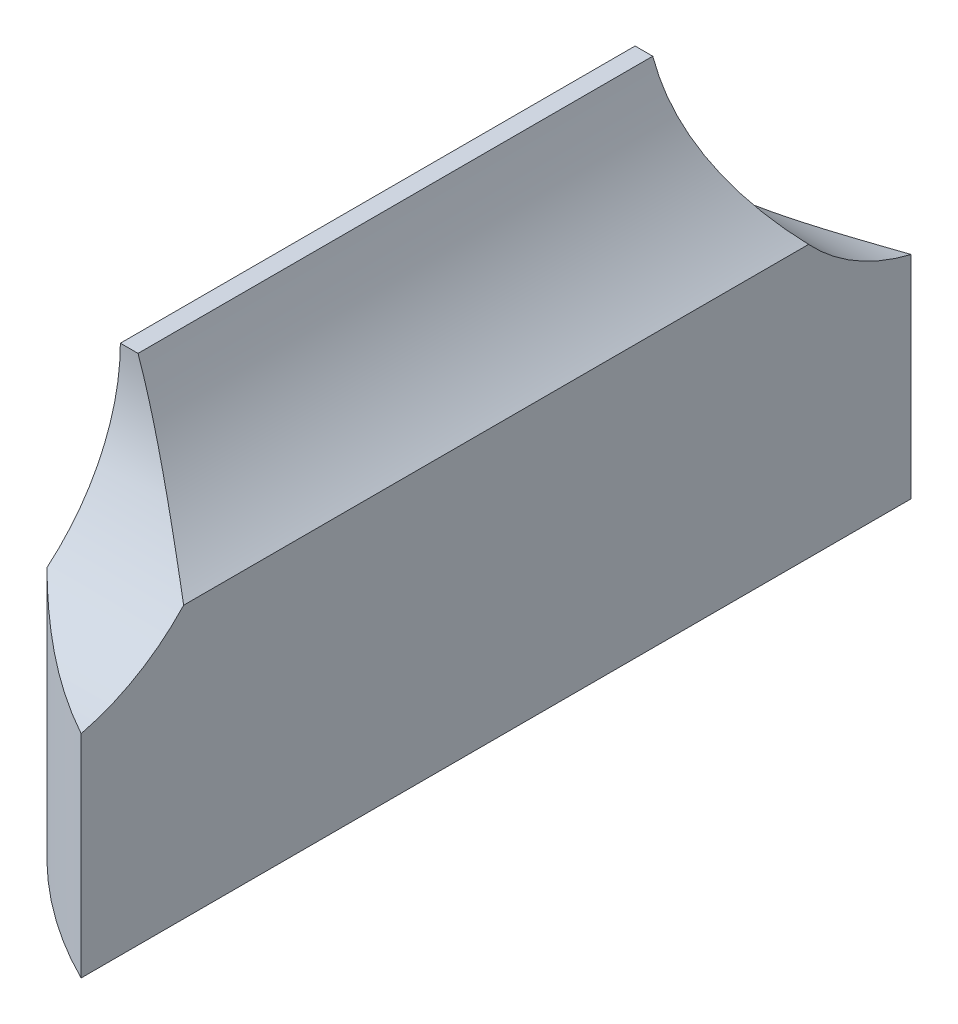
ISO-10303-21;
HEADER;
FILE_DESCRIPTION(('STEP AP214'),'2;1');
FILE_NAME('part.step','',(''),(''),'','','');
FILE_SCHEMA(('AUTOMOTIVE_DESIGN { 1 0 10303 214 1 1 1 1 }'));
ENDSEC;
DATA;
#1=APPLICATION_CONTEXT('core data for automotive mechanical design processes');
#2=APPLICATION_PROTOCOL_DEFINITION('international standard','automotive_design',2000,#1);
#3=PRODUCT_CONTEXT('',#1,'mechanical');
#4=PRODUCT('Part','Part','',(#3));
#5=PRODUCT_RELATED_PRODUCT_CATEGORY('part','',(#4));
#6=PRODUCT_DEFINITION_FORMATION('','',#4);
#7=PRODUCT_DEFINITION_CONTEXT('part definition',#1,'design');
#8=PRODUCT_DEFINITION('design','',#6,#7);
#9=PRODUCT_DEFINITION_SHAPE('','',#8);
#10=(LENGTH_UNIT() NAMED_UNIT(*) SI_UNIT(.MILLI.,.METRE.));
#11=(NAMED_UNIT(*) PLANE_ANGLE_UNIT() SI_UNIT($,.RADIAN.));
#12=(NAMED_UNIT(*) SI_UNIT($,.STERADIAN.) SOLID_ANGLE_UNIT());
#13=UNCERTAINTY_MEASURE_WITH_UNIT(LENGTH_MEASURE(1.E-05),#10,'distance_accuracy_value','');
#14=(GEOMETRIC_REPRESENTATION_CONTEXT(3) GLOBAL_UNCERTAINTY_ASSIGNED_CONTEXT((#13)) GLOBAL_UNIT_ASSIGNED_CONTEXT((#10,
#11,#12)) REPRESENTATION_CONTEXT('',''));
#15=CARTESIAN_POINT('',(0.,0.,0.));
#16=DIRECTION('',(0.,0.,1.));
#17=DIRECTION('',(1.,0.,0.));
#18=AXIS2_PLACEMENT_3D('',#15,#16,#17);
#19=CARTESIAN_POINT('',(0.,0.,0.));
#20=DIRECTION('',(0.,1.,0.));
#21=DIRECTION('',(1.,0.,0.));
#22=AXIS2_PLACEMENT_3D('',#19,#20,#21);
#23=CYLINDRICAL_SURFACE('',#22,28.575);
#24=DIRECTION('',(0.,1.,0.));
#25=VECTOR('',#24,1.);
#26=CARTESIAN_POINT('',(-12.7,0.,-25.5976683508479));
#27=LINE('',#26,#25);
#28=CARTESIAN_POINT('',(-12.7,0.,-25.5976683508479));
#29=VERTEX_POINT('',#28);
#30=CARTESIAN_POINT('',(-12.6999999902295,13.0539411382723,-25.5977402310051));
#31=VERTEX_POINT('',#30);
#32=EDGE_CURVE('E324',#29,#31,#27,.T.);
#33=ORIENTED_EDGE('',*,*,#32,.F.);
#34=CARTESIAN_POINT('',(0.,0.,0.));
#35=DIRECTION('',(0.,1.,0.));
#36=DIRECTION('',(0.,0.,1.));
#37=AXIS2_PLACEMENT_3D('',#34,#35,#36);
#38=CIRCLE('',#37,28.575);
#39=CARTESIAN_POINT('',(-20.0025,0.,-20.4066317345612));
#40=VERTEX_POINT('',#39);
#41=EDGE_CURVE('E244',#29,#40,#38,.T.);
#42=ORIENTED_EDGE('',*,*,#41,.T.);
#43=DIRECTION('',(0.,1.,0.));
#44=VECTOR('',#43,1.);
#45=CARTESIAN_POINT('',(-20.0025,0.,-20.4066317345612));
#46=LINE('',#45,#44);
#47=CARTESIAN_POINT('',(-20.002500021924,15.6757548780999,-20.4059494018305));
#48=VERTEX_POINT('',#47);
#49=EDGE_CURVE('E280',#48,#40,#46,.F.);
#50=ORIENTED_EDGE('',*,*,#49,.F.);
#51=CARTESIAN_POINT('',(-12.7000328168832,13.0538971627011,-25.5977958197599));
#52=CARTESIAN_POINT('',(-12.8081047385468,13.0668168454031,-25.5442219464865));
#53=CARTESIAN_POINT('',(-12.9157958042555,13.080258846311,-25.4900074587958));
#54=CARTESIAN_POINT('',(-13.1471686746676,13.1104431491378,-25.3717072791522));
#55=CARTESIAN_POINT('',(-13.2707151600054,13.1273727093132,-25.3074046881012));
#56=CARTESIAN_POINT('',(-13.6248694093478,13.1784078916302,-25.1197426810046));
#57=CARTESIAN_POINT('',(-13.8540399637883,13.2145208565214,-24.9941977803771));
#58=CARTESIAN_POINT('',(-14.3054896329109,13.2925640581148,-24.738641118048));
#59=CARTESIAN_POINT('',(-14.5278167405293,13.3344262310734,-24.6086933593898));
#60=CARTESIAN_POINT('',(-14.9655785716663,13.4244704629996,-24.3446393977247));
#61=CARTESIAN_POINT('',(-15.1810599635549,13.4725852034323,-24.2105877111188));
#62=CARTESIAN_POINT('',(-15.6051510146357,13.5756301209186,-23.9387052993947));
#63=CARTESIAN_POINT('',(-15.8138049489886,13.6304953596813,-23.8009192037929));
#64=CARTESIAN_POINT('',(-16.1968328640339,13.7397732066804,-23.5405056645788));
#65=CARTESIAN_POINT('',(-16.3719023817881,13.7931651792683,-23.418470215194));
#66=CARTESIAN_POINT('',(-16.7898891639244,13.9294420327401,-23.1203506597944));
#67=CARTESIAN_POINT('',(-17.0308182688671,14.015372257543,-22.9428500296811));
#68=CARTESIAN_POINT('',(-17.4726680880826,14.1881323030507,-22.6071882970164));
#69=CARTESIAN_POINT('',(-17.6746545473753,14.2733288067826,-22.4495874017132));
#70=CARTESIAN_POINT('',(-18.0687297800537,14.4531370629286,-22.1338260295291));
#71=CARTESIAN_POINT('',(-18.2609179524418,14.547599126472,-21.9757047736665));
#72=CARTESIAN_POINT('',(-18.6354100555127,14.7463016506196,-21.6595735530995));
#73=CARTESIAN_POINT('',(-18.8178089104672,14.8504017310348,-21.5015879866082));
#74=CARTESIAN_POINT('',(-19.1727235711137,15.0687301783186,-21.1864151664936));
#75=CARTESIAN_POINT('',(-19.3453280018027,15.1828302885903,-21.0292391795995));
#76=CARTESIAN_POINT('',(-19.6806651962516,15.4214396642618,-20.7164597515998));
#77=CARTESIAN_POINT('',(-19.8434780845128,15.5458360414678,-20.5608559852277));
#78=CARTESIAN_POINT('',(-20.0019983293157,15.6761376401519,-20.4057588598004));
#79=B_SPLINE_CURVE_WITH_KNOTS('',3,(#51,#52,#53,#54,#55,#56,#57,#58,#59,#60,#61,#62,#63,#64,#65,
#66,#67,#68,#69,#70,#71,#72,#73,#74,#75,#76,#77,#78),.UNSPECIFIED.,.F.,.F.,(4,2,2,2,2,2,2,2,2,2,
2,2,2,4),(0.,0.363930877339899,0.78482255493865,1.57601018208145,2.35853016431059,
3.13323222248142,3.9009920168219,4.56082120597562,5.49442520777823,6.3041096231241,
7.10237776587878,7.89044509343239,8.66957478998411,9.44107392641637),.UNSPECIFIED.);
#80=EDGE_CURVE('E264',#31,#48,#79,.T.);
#81=ORIENTED_EDGE('',*,*,#80,.F.);
#82=EDGE_LOOP('',(#33,#42,#50,#81));
#83=FACE_BOUND('',#82,.T.);
#84=ADVANCED_FACE('F49',(#83),#23,.T.);
#85=CARTESIAN_POINT('',(-0.9525,31.75,103.07574));
#86=DIRECTION('',(0.,0.,-1.));
#87=DIRECTION('',(0.,-1.,0.));
#88=AXIS2_PLACEMENT_3D('',#85,#86,#87);
#89=CYLINDRICAL_SURFACE('',#88,19.05);
#90=CARTESIAN_POINT('',(-18.9130122421383,25.4,15.875));
#91=CARTESIAN_POINT('',(-18.8497340693018,25.2210118693997,15.8749983411045));
#92=CARTESIAN_POINT('',(-18.7837855333039,25.0430075911527,15.8787844217914));
#93=CARTESIAN_POINT('',(-18.6467231259065,24.6893406660285,15.8936640856254));
#94=CARTESIAN_POINT('',(-18.5756101250626,24.5136776303775,15.9047564397118));
#95=CARTESIAN_POINT('',(-18.3550106585534,23.991278727185,15.9485421390167));
#96=CARTESIAN_POINT('',(-18.1980420811135,23.6485070556184,15.9917460206988));
#97=CARTESIAN_POINT('',(-17.8676527463349,22.9797135216138,16.1031892911451));
#98=CARTESIAN_POINT('',(-17.6944137433812,22.6535576652485,16.1711719752605));
#99=CARTESIAN_POINT('',(-17.3318691136895,22.01586555251,16.3297706721651));
#100=CARTESIAN_POINT('',(-17.1425559450336,21.7043362664966,16.4203973485763));
#101=CARTESIAN_POINT('',(-16.7049293713447,21.0280349659102,16.6447801029816));
#102=CARTESIAN_POINT('',(-16.4529997706711,20.6673005932043,16.7836581871037));
#103=CARTESIAN_POINT('',(-15.9308011524718,19.9711007243284,17.0875550697262));
#104=CARTESIAN_POINT('',(-15.6605297441538,19.6356385343733,17.2525772797803));
#105=CARTESIAN_POINT('',(-15.1032750036858,18.989084751423,17.6056610309178));
#106=CARTESIAN_POINT('',(-14.8162274474123,18.6780991821814,17.7938146310689));
#107=CARTESIAN_POINT('',(-14.2288791960802,18.0819567006576,18.189230718099));
#108=CARTESIAN_POINT('',(-13.9285774483285,17.7968018454491,18.3964947242207));
#109=CARTESIAN_POINT('',(-13.1984156246132,17.1464796343369,18.9105581416618));
#110=CARTESIAN_POINT('',(-12.7633697885075,16.7930239111386,19.2248493942131));
#111=CARTESIAN_POINT('',(-11.8763082571562,16.1333859449065,19.8781349126605));
#112=CARTESIAN_POINT('',(-11.4242863569987,15.8272212003951,20.2171382545109));
#113=CARTESIAN_POINT('',(-10.5065380825637,15.2601831655952,20.9149476019626));
#114=CARTESIAN_POINT('',(-10.0407984921444,14.9993553427282,21.2737730169768));
#115=CARTESIAN_POINT('',(-9.09905108543925,14.5216811645559,22.0066302810007));
#116=CARTESIAN_POINT('',(-8.62304394915615,14.304831906457,22.3806611244225));
#117=CARTESIAN_POINT('',(-7.55969097350217,13.8713976005961,23.222326626343));
#118=CARTESIAN_POINT('',(-6.97044213906647,13.6649246374295,23.6927739133145));
#119=CARTESIAN_POINT('',(-5.78364541772904,13.312379689528,24.6459168261099));
#120=CARTESIAN_POINT('',(-5.18609478958904,13.1663281705537,25.1286165433765));
#121=CARTESIAN_POINT('',(-3.98717431390972,12.9333741588415,26.1006321479538));
#122=CARTESIAN_POINT('',(-3.38581552424748,12.8463443988912,26.5899314644817));
#123=CARTESIAN_POINT('',(-2.18085829712548,12.7300198955487,27.5720588304996));
#124=CARTESIAN_POINT('',(-1.57726149500966,12.7006890890866,28.064884482488));
#125=CARTESIAN_POINT('',(-0.966754793001582,12.7000040018608,28.5633610103794));
#126=CARTESIAN_POINT('',(-0.95962738006711,12.7000000019469,28.5691805186742));
#127=CARTESIAN_POINT('',(-0.9525,12.7,28.575));
#128=B_SPLINE_CURVE_WITH_KNOTS('',3,(#90,#91,#92,#93,#94,#95,#96,#97,#98,#99,#100,#101,#102,
#103,#104,#105,#106,#107,#108,#109,#110,#111,#112,#113,#114,#115,#116,#117,#118,#119,#120,#121,
#122,#123,#124,#125,#126,#127),.UNSPECIFIED.,.F.,.F.,(4,2,2,2,2,2,2,2,2,2,2,2,2,2,2,2,2,2,4),
(0.,0.569405310393191,1.13871485992012,2.27535004648464,3.40052983933086,4.52624050947126,
5.9083905584972,7.29072111341501,8.6787429283433,10.0668751837947,11.9919097522487,
13.917654920933,15.8453203726628,17.7728585478994,20.115464646911,22.4588635776714,
24.7971932887953,27.1340610293043,27.1616653793962),.UNSPECIFIED.);
#129=CARTESIAN_POINT('',(-18.9130122421383,25.4,15.875));
#130=VERTEX_POINT('',#129);
#131=CARTESIAN_POINT('',(-12.7,16.7533755881532,19.2730708301743));
#132=VERTEX_POINT('',#131);
#133=EDGE_CURVE('E130',#130,#132,#128,.T.);
#134=ORIENTED_EDGE('',*,*,#133,.T.);
#135=DIRECTION('',(0.,0.,-1.));
#136=VECTOR('',#135,1.);
#137=CARTESIAN_POINT('',(-12.7,16.7533755881532,103.07574));
#138=LINE('',#137,#136);
#139=CARTESIAN_POINT('',(-12.6999998687876,16.7536945326387,-19.2730582369655));
#140=VERTEX_POINT('',#139);
#141=EDGE_CURVE('E68',#132,#140,#138,.T.);
#142=ORIENTED_EDGE('',*,*,#141,.T.);
#143=CARTESIAN_POINT('',(-18.9130122421383,25.4,-15.875));
#144=CARTESIAN_POINT('',(-18.8626214367329,25.2648276233783,-15.8749945149163));
#145=CARTESIAN_POINT('',(-18.8117207478638,25.1298398647751,-15.8771580605399));
#146=CARTESIAN_POINT('',(-18.7129604021271,24.8725351575405,-15.8853658286525));
#147=CARTESIAN_POINT('',(-18.6652314650349,24.7501563281996,-15.8910488212055));
#148=CARTESIAN_POINT('',(-18.5728177693084,24.5181293049488,-15.9051745343732));
#149=CARTESIAN_POINT('',(-18.5282879917753,24.4083998022345,-15.9132953546811));
#150=CARTESIAN_POINT('',(-18.4423104863336,24.2016597974375,-15.9312842291498));
#151=CARTESIAN_POINT('',(-18.4010456447489,24.1045494103142,-15.9408708196685));
#152=CARTESIAN_POINT('',(-18.3327294150212,23.9491355686568,-15.9580069575726));
#153=CARTESIAN_POINT('',(-18.3063984610142,23.8904418019152,-15.9648966775626));
#154=CARTESIAN_POINT('',(-18.2147951170109,23.6895929204792,-15.9898860573859));
#155=CARTESIAN_POINT('',(-18.147825682967,23.5484475628139,-16.0098932502915));
#156=CARTESIAN_POINT('',(-17.9744463608505,23.1935612014671,-16.066247998897));
#157=CARTESIAN_POINT('',(-17.8660547912868,22.9812606298124,-16.105618832032));
#158=CARTESIAN_POINT('',(-17.6771632093597,22.6277512555392,-16.1803897530837));
#159=CARTESIAN_POINT('',(-17.5984973922152,22.4850049896949,-16.2132039271015));
#160=CARTESIAN_POINT('',(-17.4825815087581,22.2808095992132,-16.2638323851313));
#161=CARTESIAN_POINT('',(-17.4465739703863,22.2182053263794,-16.2798653143452));
#162=CARTESIAN_POINT('',(-17.2955115616295,21.9590053311519,-16.3483477551744));
#163=CARTESIAN_POINT('',(-17.177680624085,21.7650199910601,-16.4046669879607));
#164=CARTESIAN_POINT('',(-16.9338127754479,21.3791103797921,-16.5265865833717));
#165=CARTESIAN_POINT('',(-16.8076546568963,21.187317627151,-16.5923588214102));
#166=CARTESIAN_POINT('',(-16.5471166055158,20.8062437320132,-16.7331441784388));
#167=CARTESIAN_POINT('',(-16.4126179391228,20.6171063336692,-16.8083262200132));
#168=CARTESIAN_POINT('',(-16.1353885755606,20.2418033226618,-16.9678691653342));
#169=CARTESIAN_POINT('',(-15.9925421934348,20.0557930746363,-17.0523948031776));
#170=CARTESIAN_POINT('',(-15.7943431002165,19.8072428283444,-17.1725227174458));
#171=CARTESIAN_POINT('',(-15.7411536160871,19.7414502737772,-17.2050322987756));
#172=CARTESIAN_POINT('',(-15.6055983002389,19.5760568345813,-17.2885364576574));
#173=CARTESIAN_POINT('',(-15.5227917173962,19.4771266482311,-17.3401481030605));
#174=CARTESIAN_POINT('',(-15.3062887529157,19.2237567177762,-17.4765651864114));
#175=CARTESIAN_POINT('',(-15.1714751676829,19.0711121872497,-17.5629399376589));
#176=CARTESIAN_POINT('',(-14.8949656353853,18.7678631561025,-17.7427962808453));
#177=CARTESIAN_POINT('',(-14.753181868802,18.6174138233302,-17.8364039818606));
#178=CARTESIAN_POINT('',(-14.4627226882301,18.3189308751102,-18.0307606346486));
#179=CARTESIAN_POINT('',(-14.3139637684477,18.1710577271823,-18.1316310618897));
#180=CARTESIAN_POINT('',(-14.0095508199111,17.8781158359111,-18.3405271853636));
#181=CARTESIAN_POINT('',(-13.8538175585003,17.7332126065009,-18.4486693258685));
#182=CARTESIAN_POINT('',(-13.5354531344088,17.4466084096042,-18.6721013121384));
#183=CARTESIAN_POINT('',(-13.3727468257159,17.3050776875598,-18.7875021989448));
#184=CARTESIAN_POINT('',(-13.0404256499506,17.0256239682438,-19.0254289680463));
#185=CARTESIAN_POINT('',(-12.8707393229377,16.8878756315075,-19.1480603249865));
#186=CARTESIAN_POINT('',(-12.6996862699256,16.7537679191644,-19.2727061536237));
#187=B_SPLINE_CURVE_WITH_KNOTS('',3,(#143,#144,#145,#146,#147,#148,#149,#150,#151,#152,#153,
#154,#155,#156,#157,#158,#159,#160,#161,#162,#163,#164,#165,#166,#167,#168,#169,#170,#171,#172,
#173,#174,#175,#176,#177,#178,#179,#180,#181,#182,#183,#184,#185,#186),.UNSPECIFIED.,.F.,.F.,(4,
2,2,2,2,2,2,2,2,2,2,2,2,2,2,2,2,2,2,2,2,4),(0.,0.432768495421759,0.827151258287931,
1.18320381967725,1.50100216150825,1.69508410052054,2.16747508219468,2.89186908900796,
3.39052415737425,3.61245574245645,4.31367076502273,5.02979506371342,5.7613883467752,
6.50897557895269,6.78087197211069,7.19768612763921,7.86115549330944,8.54180441937825,
9.23987975264813,9.95561030894167,10.6892083830743,11.4408711301362),.UNSPECIFIED.);
#188=CARTESIAN_POINT('',(-18.9130122421383,25.4,-15.875));
#189=VERTEX_POINT('',#188);
#190=EDGE_CURVE('E261',#189,#140,#187,.T.);
#191=ORIENTED_EDGE('',*,*,#190,.F.);
#192=DIRECTION('',(0.,0.,-1.));
#193=VECTOR('',#192,1.);
#194=CARTESIAN_POINT('',(-18.9130122421383,25.4,103.07574));
#195=LINE('',#194,#193);
#196=EDGE_CURVE('E270',#130,#189,#195,.T.);
#197=ORIENTED_EDGE('',*,*,#196,.F.);
#198=EDGE_LOOP('',(#134,#142,#191,#197));
#199=FACE_BOUND('',#198,.T.);
#200=ADVANCED_FACE('F156',(#199),#89,.F.);
#201=DIRECTION('',(0.,1.,0.));
#202=VECTOR('',#201,1.);
#203=CARTESIAN_POINT('',(-12.7,0.,25.5976683508479));
#204=LINE('',#203,#202);
#205=CARTESIAN_POINT('',(-12.7,13.0539279019213,25.5976683508479));
#206=VERTEX_POINT('',#205);
#207=CARTESIAN_POINT('',(-12.7,0.,25.5976683508479));
#208=VERTEX_POINT('',#207);
#209=EDGE_CURVE('E111',#206,#208,#204,.F.);
#210=ORIENTED_EDGE('',*,*,#209,.F.);
#211=CARTESIAN_POINT('',(-0.962642902409268,12.7000103571768,28.558780499917));
#212=CARTESIAN_POINT('',(-1.360776150308,12.7000623405133,28.5453656938384));
#213=CARTESIAN_POINT('',(-1.75862825688904,12.7000777129765,28.5236151588993));
#214=CARTESIAN_POINT('',(-2.55307899623697,12.7004445435241,28.4635033904881));
#215=CARTESIAN_POINT('',(-2.94967761792567,12.7007960045706,28.4251420106221));
#216=CARTESIAN_POINT('',(-3.74118366921356,12.7022448100237,28.3318388404825));
#217=CARTESIAN_POINT('',(-4.13608981320238,12.7033426454376,28.2768861487448));
#218=CARTESIAN_POINT('',(-4.92324947447722,12.7069381444453,28.1505085427591));
#219=CARTESIAN_POINT('',(-5.31550300582046,12.7094358006151,28.0790837158739));
#220=CARTESIAN_POINT('',(-6.09971504116634,12.7166858056301,27.9192672118528));
#221=CARTESIAN_POINT('',(-6.49164726347302,12.7214556290704,27.8307472529654));
#222=CARTESIAN_POINT('',(-7.27137941730528,12.7342954372854,27.6372759368344));
#223=CARTESIAN_POINT('',(-7.65917937418507,12.7423654017996,27.5323246804699));
#224=CARTESIAN_POINT('',(-8.42975640725776,12.7630247664454,27.3062442784221));
#225=CARTESIAN_POINT('',(-8.81253540320888,12.7756123837613,27.1851215263726));
#226=CARTESIAN_POINT('',(-9.57240196747794,12.8067151018844,26.9269527073139));
#227=CARTESIAN_POINT('',(-9.94948990979465,12.8252298113893,26.7899076918614));
#228=CARTESIAN_POINT('',(-10.872892757589,12.8802289714999,26.4321390526004));
#229=CARTESIAN_POINT('',(-11.4154826552638,12.9210691871269,26.2023507001296));
#230=CARTESIAN_POINT('',(-12.4837500266746,13.0247001334087,25.7105492113084));
#231=CARTESIAN_POINT('',(-13.0094275044063,13.0874908588777,25.4485360825714));
#232=CARTESIAN_POINT('',(-14.0386470858098,13.2413188734453,24.8955218171353));
#233=CARTESIAN_POINT('',(-14.5422624205979,13.3322531031986,24.604629033279));
#234=CARTESIAN_POINT('',(-15.525303301913,13.5496409172654,23.9964408297592));
#235=CARTESIAN_POINT('',(-16.0047377469761,13.6760813211802,23.6791552381835));
#236=CARTESIAN_POINT('',(-16.8002547898696,13.9292795839768,23.1180863962723));
#237=CARTESIAN_POINT('',(-17.12347917105,14.0453697562296,22.879584210023));
#238=CARTESIAN_POINT('',(-17.7534814131743,14.3020869365986,22.3942506229862));
#239=CARTESIAN_POINT('',(-18.0602635161122,14.4427075758017,22.1474213975555));
#240=CARTESIAN_POINT('',(-18.6552298763255,14.7509891906524,21.6486405827841));
#241=CARTESIAN_POINT('',(-18.9434257661047,14.9186330188443,21.3966923297255));
#242=CARTESIAN_POINT('',(-19.4993082019246,15.283253526771,20.891352140316));
#243=CARTESIAN_POINT('',(-19.7669984548302,15.4802248858392,20.6379604738353));
#244=CARTESIAN_POINT('',(-20.2341271799023,15.8672649269097,20.1791498359515));
#245=CARTESIAN_POINT('',(-20.4372307457045,16.0523162460652,19.9732236603815));
#246=CARTESIAN_POINT('',(-20.8271119032822,16.4437967712389,19.5663328087751));
#247=CARTESIAN_POINT('',(-21.0138928922229,16.6502215092427,19.3653671066091));
#248=CARTESIAN_POINT('',(-21.3701713388689,17.0844581862876,18.97147678078));
#249=CARTESIAN_POINT('',(-21.5396731298456,17.3122647355442,18.7785501482928));
#250=CARTESIAN_POINT('',(-21.8606787693188,17.7888329761912,18.4038644456923));
#251=CARTESIAN_POINT('',(-22.0121823832137,18.0375949406577,18.2221055211622));
#252=CARTESIAN_POINT('',(-22.2974382725317,18.5565357054137,17.8719385766044));
#253=CARTESIAN_POINT('',(-22.4310835814289,18.8268293204683,17.7036132443668));
#254=CARTESIAN_POINT('',(-22.6792372793649,19.3860036069173,17.3845820904193));
#255=CARTESIAN_POINT('',(-22.7937450745915,19.6748848546768,17.2338768154804));
#256=CARTESIAN_POINT('',(-23.0034597025055,20.2691361978424,16.9529413254661));
#257=CARTESIAN_POINT('',(-23.0986674148251,20.5745055409733,16.82271017731));
#258=CARTESIAN_POINT('',(-23.2697906025732,21.1992400080776,16.5852020755226));
#259=CARTESIAN_POINT('',(-23.3457083796057,21.5186034569894,16.4779223836495));
#260=CARTESIAN_POINT('',(-23.4701116509625,22.12802888617,16.3001450750939));
#261=CARTESIAN_POINT('',(-23.5208356823847,22.4167889072292,16.2267309964582));
#262=CARTESIAN_POINT('',(-23.6076984467591,23.0008228742548,16.1000964209121));
#263=CARTESIAN_POINT('',(-23.6438389597464,23.2960960205993,16.0468734595617));
#264=CARTESIAN_POINT('',(-23.7016972572095,23.891676000038,15.9612926924243));
#265=CARTESIAN_POINT('',(-23.7233869802868,24.1919914725829,15.9289754861824));
#266=CARTESIAN_POINT('',(-23.7450719580124,24.6440955561162,15.8966136680399));
#267=CARTESIAN_POINT('',(-23.750492013807,24.7951042402365,15.8885120518578));
#268=CARTESIAN_POINT('',(-23.7577175691629,25.0974022821663,15.8777046290994));
#269=CARTESIAN_POINT('',(-23.7595230358051,25.2486916425195,15.8749988716645));
#270=CARTESIAN_POINT('',(-23.7595244060145,25.3999999989417,15.875));
#271=B_SPLINE_CURVE_WITH_KNOTS('',3,(#211,#212,#213,#214,#215,#216,#217,#218,#219,#220,#221,
#222,#223,#224,#225,#226,#227,#228,#229,#230,#231,#232,#233,#234,#235,#236,#237,#238,#239,#240,
#241,#242,#243,#244,#245,#246,#247,#248,#249,#250,#251,#252,#253,#254,#255,#256,#257,#258,#259,
#260,#261,#262,#263,#264,#265,#266,#267,#268,#269,#270),.UNSPECIFIED.,.F.,.F.,(4,2,2,2,2,2,2,2,
2,2,2,2,2,2,2,2,2,2,2,2,2,2,2,2,2,2,2,2,2,4),(0.,1.19499017100452,2.389990873859,
3.58577847732222,4.78155973885825,5.9866896546564,7.19181217191537,8.39645962980389,
9.60102757414414,11.3715014481911,13.1419749039518,14.9060402358506,16.6694515852103,
17.9228644913728,19.175952453502,20.4282483813576,21.6803173910827,22.7094151795744,
23.7382982726202,24.7669227046662,25.7955605430909,26.8301070987873,27.8646857491643,
28.8992172363465,29.9336252290131,30.8392539837863,31.7447721658648,32.6520436511391,
33.105891745553,33.5597439732612),.UNSPECIFIED.);
#272=CARTESIAN_POINT('',(-20.0025,15.6754043847483,20.4066317345612));
#273=VERTEX_POINT('',#272);
#274=EDGE_CURVE('E121',#206,#273,#271,.T.);
#275=ORIENTED_EDGE('',*,*,#274,.T.);
#276=DIRECTION('',(0.,1.,0.));
#277=VECTOR('',#276,1.);
#278=CARTESIAN_POINT('',(-20.0025,0.,20.4066317345612));
#279=LINE('',#278,#277);
#280=CARTESIAN_POINT('',(-20.0025,0.,20.4066317345612));
#281=VERTEX_POINT('',#280);
#282=EDGE_CURVE('E329',#281,#273,#279,.T.);
#283=ORIENTED_EDGE('',*,*,#282,.F.);
#284=EDGE_CURVE('E123',#281,#208,#38,.T.);
#285=ORIENTED_EDGE('',*,*,#284,.T.);
#286=EDGE_LOOP('',(#210,#275,#283,#285));
#287=FACE_BOUND('',#286,.T.);
#288=ADVANCED_FACE('F119',(#287),#23,.T.);
#289=CARTESIAN_POINT('',(0.,0.,0.));
#290=DIRECTION('',(0.,1.,0.));
#291=DIRECTION('',(1.,0.,0.));
#292=AXIS2_PLACEMENT_3D('',#289,#290,#291);
#293=PLANE('',#292);
#294=ORIENTED_EDGE('',*,*,#41,.F.);
#295=DIRECTION('',(0.,0.,1.));
#296=VECTOR('',#295,1.);
#297=CARTESIAN_POINT('',(-12.7,0.,0.));
#298=LINE('',#297,#296);
#299=EDGE_CURVE('E326',#29,#208,#298,.T.);
#300=ORIENTED_EDGE('',*,*,#299,.T.);
#301=ORIENTED_EDGE('',*,*,#284,.F.);
#302=DIRECTION('',(0.,0.,-1.));
#303=VECTOR('',#302,1.);
#304=CARTESIAN_POINT('',(-20.0025,0.,0.));
#305=LINE('',#304,#303);
#306=EDGE_CURVE('E274',#281,#40,#305,.T.);
#307=ORIENTED_EDGE('',*,*,#306,.T.);
#308=EDGE_LOOP('',(#294,#300,#301,#307));
#309=FACE_BOUND('',#308,.T.);
#310=ADVANCED_FACE('F51',(#309),#293,.F.);
#311=CARTESIAN_POINT('',(-31.75,25.4,-28.575));
#312=DIRECTION('',(-1.,0.,0.));
#313=DIRECTION('',(0.,0.,1.));
#314=AXIS2_PLACEMENT_3D('',#311,#312,#313);
#315=CYLINDRICAL_SURFACE('',#314,12.7);
#316=ORIENTED_EDGE('',*,*,#190,.T.);
#317=CARTESIAN_POINT('',(-12.7,25.4,-28.575));
#318=DIRECTION('',(-1.,0.,0.));
#319=DIRECTION('',(0.,0.,1.));
#320=AXIS2_PLACEMENT_3D('',#317,#318,#319);
#321=CIRCLE('',#320,12.7);
#322=EDGE_CURVE('E347',#140,#31,#321,.F.);
#323=ORIENTED_EDGE('',*,*,#322,.T.);
#324=ORIENTED_EDGE('',*,*,#80,.T.);
#325=CARTESIAN_POINT('',(-20.0025,25.4,-28.575));
#326=DIRECTION('',(1.,0.,0.));
#327=DIRECTION('',(0.,0.,-1.));
#328=AXIS2_PLACEMENT_3D('',#325,#326,#327);
#329=CIRCLE('',#328,12.7);
#330=CARTESIAN_POINT('',(-20.0025,25.4,-15.875));
#331=VERTEX_POINT('',#330);
#332=EDGE_CURVE('E331',#48,#331,#329,.F.);
#333=ORIENTED_EDGE('',*,*,#332,.T.);
#334=DIRECTION('',(-1.,0.,0.));
#335=VECTOR('',#334,1.);
#336=CARTESIAN_POINT('',(-31.75,25.4,-15.875));
#337=LINE('',#336,#335);
#338=EDGE_CURVE('E136',#331,#189,#337,.F.);
#339=ORIENTED_EDGE('',*,*,#338,.T.);
#340=EDGE_LOOP('',(#316,#323,#324,#333,#339));
#341=FACE_BOUND('',#340,.T.);
#342=ADVANCED_FACE('F298',(#341),#315,.F.);
#343=CARTESIAN_POINT('',(-31.75,25.4,28.575));
#344=DIRECTION('',(1.,0.,0.));
#345=DIRECTION('',(0.,0.,-1.));
#346=AXIS2_PLACEMENT_3D('',#343,#344,#345);
#347=CYLINDRICAL_SURFACE('',#346,12.7);
#348=ORIENTED_EDGE('',*,*,#274,.F.);
#349=CARTESIAN_POINT('',(-12.7,25.4,28.575));
#350=DIRECTION('',(-1.,0.,0.));
#351=DIRECTION('',(0.,0.,1.));
#352=AXIS2_PLACEMENT_3D('',#349,#350,#351);
#353=CIRCLE('',#352,12.7);
#354=EDGE_CURVE('E13',#206,#132,#353,.F.);
#355=ORIENTED_EDGE('',*,*,#354,.T.);
#356=ORIENTED_EDGE('',*,*,#133,.F.);
#357=DIRECTION('',(1.,0.,0.));
#358=VECTOR('',#357,1.);
#359=CARTESIAN_POINT('',(-31.75,25.4,15.875));
#360=LINE('',#359,#358);
#361=CARTESIAN_POINT('',(-20.0025,25.4,15.875));
#362=VERTEX_POINT('',#361);
#363=EDGE_CURVE('E129',#362,#130,#360,.T.);
#364=ORIENTED_EDGE('',*,*,#363,.F.);
#365=CARTESIAN_POINT('',(-20.0025,25.4,28.575));
#366=DIRECTION('',(1.,0.,0.));
#367=DIRECTION('',(0.,0.,-1.));
#368=AXIS2_PLACEMENT_3D('',#365,#366,#367);
#369=CIRCLE('',#368,12.7);
#370=EDGE_CURVE('E75',#362,#273,#369,.F.);
#371=ORIENTED_EDGE('',*,*,#370,.T.);
#372=EDGE_LOOP('',(#348,#355,#356,#364,#371));
#373=FACE_BOUND('',#372,.T.);
#374=ADVANCED_FACE('F126',(#373),#347,.F.);
#375=CARTESIAN_POINT('',(0.,25.4,0.));
#376=DIRECTION('',(0.,1.,0.));
#377=DIRECTION('',(0.,0.,1.));
#378=AXIS2_PLACEMENT_3D('',#375,#376,#377);
#379=PLANE('',#378);
#380=DIRECTION('',(0.,0.,-1.));
#381=VECTOR('',#380,1.);
#382=CARTESIAN_POINT('',(-20.0025,25.4,0.));
#383=LINE('',#382,#381);
#384=EDGE_CURVE('E60',#362,#331,#383,.T.);
#385=ORIENTED_EDGE('',*,*,#384,.F.);
#386=ORIENTED_EDGE('',*,*,#363,.T.);
#387=ORIENTED_EDGE('',*,*,#196,.T.);
#388=ORIENTED_EDGE('',*,*,#338,.F.);
#389=EDGE_LOOP('',(#385,#386,#387,#388));
#390=FACE_BOUND('',#389,.T.);
#391=ADVANCED_FACE('F318',(#390),#379,.T.);
#392=CARTESIAN_POINT('',(-20.0025,0.,0.));
#393=DIRECTION('',(1.,0.,0.));
#394=DIRECTION('',(0.,0.,-1.));
#395=AXIS2_PLACEMENT_3D('',#392,#393,#394);
#396=PLANE('',#395);
#397=ORIENTED_EDGE('',*,*,#282,.T.);
#398=ORIENTED_EDGE('',*,*,#370,.F.);
#399=ORIENTED_EDGE('',*,*,#384,.T.);
#400=ORIENTED_EDGE('',*,*,#332,.F.);
#401=ORIENTED_EDGE('',*,*,#49,.T.);
#402=ORIENTED_EDGE('',*,*,#306,.F.);
#403=EDGE_LOOP('',(#397,#398,#399,#400,#401,#402));
#404=FACE_BOUND('',#403,.T.);
#405=ADVANCED_FACE('F328',(#404),#396,.F.);
#406=CARTESIAN_POINT('',(-12.7,0.,0.));
#407=DIRECTION('',(-1.,0.,0.));
#408=DIRECTION('',(0.,0.,1.));
#409=AXIS2_PLACEMENT_3D('',#406,#407,#408);
#410=PLANE('',#409);
#411=ORIENTED_EDGE('',*,*,#32,.T.);
#412=ORIENTED_EDGE('',*,*,#322,.F.);
#413=ORIENTED_EDGE('',*,*,#141,.F.);
#414=ORIENTED_EDGE('',*,*,#354,.F.);
#415=ORIENTED_EDGE('',*,*,#209,.T.);
#416=ORIENTED_EDGE('',*,*,#299,.F.);
#417=EDGE_LOOP('',(#411,#412,#413,#414,#415,#416));
#418=FACE_BOUND('',#417,.T.);
#419=ADVANCED_FACE('F110',(#418),#410,.F.);
#420=CLOSED_SHELL('',(#84,#200,#288,#310,#342,#374,#391,#405,#419));
#421=MANIFOLD_SOLID_BREP('B2',#420);
#422=ADVANCED_BREP_SHAPE_REPRESENTATION('',(#18,#421),#14);
#423=SHAPE_DEFINITION_REPRESENTATION(#9,#422);
ENDSEC;
END-ISO-10303-21;
